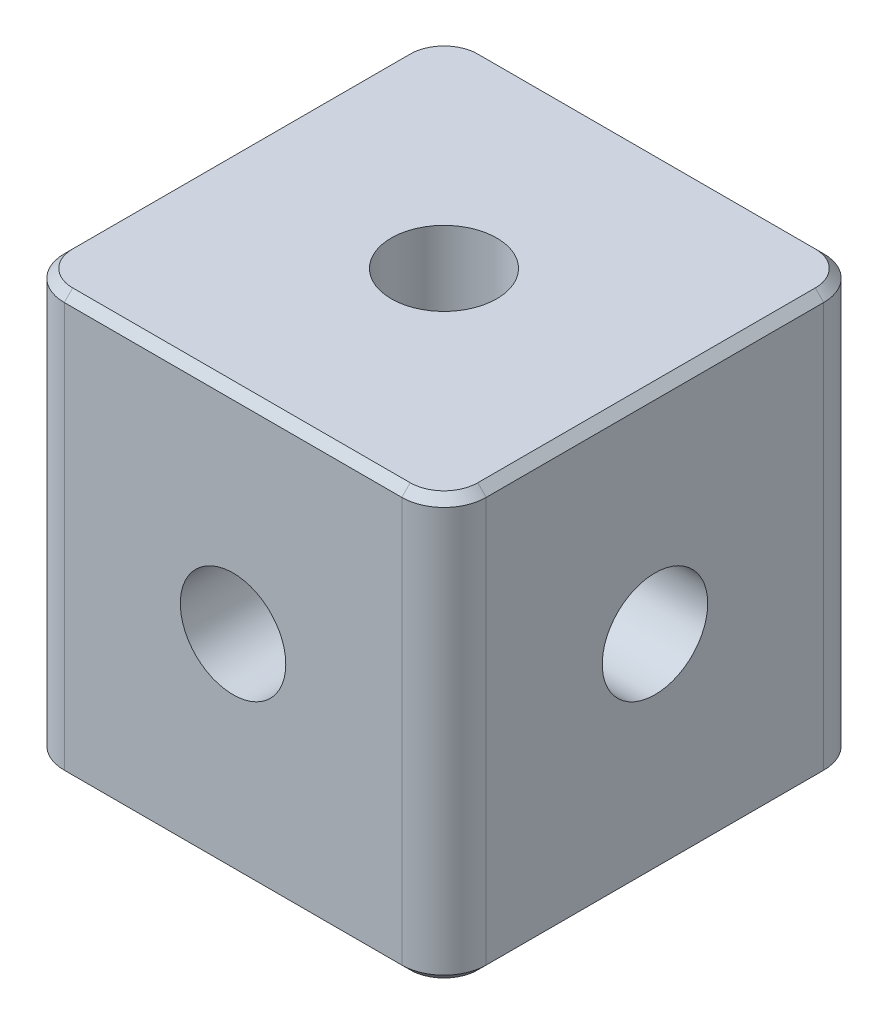
ISO-10303-21;
HEADER;
FILE_DESCRIPTION(('STEP AP214'),'2;1');
FILE_NAME('part.step','',(''),(''),'','','');
FILE_SCHEMA(('AUTOMOTIVE_DESIGN { 1 0 10303 214 1 1 1 1 }'));
ENDSEC;
DATA;
#1=APPLICATION_CONTEXT('core data for automotive mechanical design processes');
#2=APPLICATION_PROTOCOL_DEFINITION('international standard','automotive_design',2000,#1);
#3=PRODUCT_CONTEXT('',#1,'mechanical');
#4=PRODUCT('Part','Part','',(#3));
#5=PRODUCT_RELATED_PRODUCT_CATEGORY('part','',(#4));
#6=PRODUCT_DEFINITION_FORMATION('','',#4);
#7=PRODUCT_DEFINITION_CONTEXT('part definition',#1,'design');
#8=PRODUCT_DEFINITION('design','',#6,#7);
#9=PRODUCT_DEFINITION_SHAPE('','',#8);
#10=(LENGTH_UNIT() NAMED_UNIT(*) SI_UNIT(.MILLI.,.METRE.));
#11=(NAMED_UNIT(*) PLANE_ANGLE_UNIT() SI_UNIT($,.RADIAN.));
#12=(NAMED_UNIT(*) SI_UNIT($,.STERADIAN.) SOLID_ANGLE_UNIT());
#13=UNCERTAINTY_MEASURE_WITH_UNIT(LENGTH_MEASURE(1.E-05),#10,'distance_accuracy_value','');
#14=(GEOMETRIC_REPRESENTATION_CONTEXT(3) GLOBAL_UNCERTAINTY_ASSIGNED_CONTEXT((#13)) GLOBAL_UNIT_ASSIGNED_CONTEXT((#10,
#11,#12)) REPRESENTATION_CONTEXT('',''));
#15=CARTESIAN_POINT('',(0.,0.,0.));
#16=DIRECTION('',(0.,0.,1.));
#17=DIRECTION('',(1.,0.,0.));
#18=AXIS2_PLACEMENT_3D('',#15,#16,#17);
#19=CARTESIAN_POINT('',(0.,5.,0.));
#20=DIRECTION('',(0.,1.,0.));
#21=DIRECTION('',(0.,0.,1.));
#22=AXIS2_PLACEMENT_3D('',#19,#20,#21);
#23=CYLINDRICAL_SURFACE('',#22,1.25);
#24=CARTESIAN_POINT('',(0.,5.,0.));
#25=DIRECTION('',(0.,1.,0.));
#26=DIRECTION('',(0.,0.,1.));
#27=AXIS2_PLACEMENT_3D('',#24,#25,#26);
#28=CIRCLE('',#27,1.25);
#29=CARTESIAN_POINT('',(0.,5.,1.25));
#30=VERTEX_POINT('',#29);
#31=EDGE_CURVE('E492',#30,#30,#28,.T.);
#32=ORIENTED_EDGE('',*,*,#31,.T.);
#33=EDGE_LOOP('',(#32));
#34=FACE_BOUND('',#33,.T.);
#35=CARTESIAN_POINT('',(0.,0.,0.));
#36=DIRECTION('',(0.,0.707106781186547,-0.707106781186547));
#37=DIRECTION('',(0.,0.707106781186547,0.707106781186547));
#38=AXIS2_PLACEMENT_3D('',#35,#36,#37);
#39=ELLIPSE('',#38,1.76776695296636,1.25);
#40=CARTESIAN_POINT('',(0.883883476483181,0.883883476483181,0.883883476483181));
#41=VERTEX_POINT('',#40);
#42=CARTESIAN_POINT('',(-0.883883476483181,0.883883476483181,0.883883476483181));
#43=VERTEX_POINT('',#42);
#44=EDGE_CURVE('E210',#41,#43,#39,.F.);
#45=ORIENTED_EDGE('',*,*,#44,.T.);
#46=CARTESIAN_POINT('',(0.,0.,0.));
#47=DIRECTION('',(0.707106781186547,0.707106781186547,0.));
#48=DIRECTION('',(-0.707106781186547,0.707106781186547,0.));
#49=AXIS2_PLACEMENT_3D('',#46,#47,#48);
#50=ELLIPSE('',#49,1.76776695296636,1.25);
#51=CARTESIAN_POINT('',(-0.88388347648318,0.88388347648318,-0.88388347648318));
#52=VERTEX_POINT('',#51);
#53=EDGE_CURVE('E193',#43,#52,#50,.F.);
#54=ORIENTED_EDGE('',*,*,#53,.T.);
#55=CARTESIAN_POINT('',(0.,0.,0.));
#56=DIRECTION('',(0.,0.707106781186547,0.707106781186547));
#57=DIRECTION('',(0.,0.707106781186547,-0.707106781186547));
#58=AXIS2_PLACEMENT_3D('',#55,#56,#57);
#59=ELLIPSE('',#58,1.76776695296636,1.25);
#60=CARTESIAN_POINT('',(0.883883476483181,0.883883476483181,-0.883883476483181));
#61=VERTEX_POINT('',#60);
#62=EDGE_CURVE('E203',#52,#61,#59,.F.);
#63=ORIENTED_EDGE('',*,*,#62,.T.);
#64=CARTESIAN_POINT('',(0.,0.,0.));
#65=DIRECTION('',(-0.707106781186547,0.707106781186547,0.));
#66=DIRECTION('',(0.707106781186547,0.707106781186547,0.));
#67=AXIS2_PLACEMENT_3D('',#64,#65,#66);
#68=ELLIPSE('',#67,1.76776695296636,1.25);
#69=EDGE_CURVE('E519',#61,#41,#68,.F.);
#70=ORIENTED_EDGE('',*,*,#69,.T.);
#71=EDGE_LOOP('',(#45,#54,#63,#70));
#72=FACE_BOUND('',#71,.T.);
#73=ADVANCED_FACE('F49',(#34,#72),#23,.F.);
#74=CARTESIAN_POINT('',(5.,5.,5.));
#75=DIRECTION('',(-1.,0.,0.));
#76=DIRECTION('',(0.,0.,1.));
#77=AXIS2_PLACEMENT_3D('',#74,#75,#76);
#78=PLANE('',#77);
#79=CARTESIAN_POINT('',(5.,0.,0.));
#80=DIRECTION('',(1.,0.,0.));
#81=DIRECTION('',(0.,0.,-1.));
#82=AXIS2_PLACEMENT_3D('',#79,#80,#81);
#83=CIRCLE('',#82,1.24999999999999);
#84=CARTESIAN_POINT('',(5.,0.,-1.24999999999999));
#85=VERTEX_POINT('',#84);
#86=EDGE_CURVE('E383',#85,#85,#83,.T.);
#87=ORIENTED_EDGE('',*,*,#86,.F.);
#88=EDGE_LOOP('',(#87));
#89=FACE_BOUND('',#88,.T.);
#90=DIRECTION('',(0.,-1.,0.));
#91=VECTOR('',#90,1.);
#92=CARTESIAN_POINT('',(5.,5.,4.));
#93=LINE('',#92,#91);
#94=CARTESIAN_POINT('',(5.,4.8,4.));
#95=VERTEX_POINT('',#94);
#96=CARTESIAN_POINT('',(5.,-4.8,4.));
#97=VERTEX_POINT('',#96);
#98=EDGE_CURVE('E235',#95,#97,#93,.T.);
#99=ORIENTED_EDGE('',*,*,#98,.T.);
#100=DIRECTION('',(0.,0.,-1.));
#101=VECTOR('',#100,1.);
#102=CARTESIAN_POINT('',(5.,-4.8,-4.));
#103=LINE('',#102,#101);
#104=CARTESIAN_POINT('',(5.,-4.8,-4.));
#105=VERTEX_POINT('',#104);
#106=EDGE_CURVE('E263',#97,#105,#103,.T.);
#107=ORIENTED_EDGE('',*,*,#106,.T.);
#108=DIRECTION('',(0.,-1.,0.));
#109=VECTOR('',#108,1.);
#110=CARTESIAN_POINT('',(5.,5.,-4.));
#111=LINE('',#110,#109);
#112=CARTESIAN_POINT('',(5.,4.8,-4.));
#113=VERTEX_POINT('',#112);
#114=EDGE_CURVE('E239',#105,#113,#111,.F.);
#115=ORIENTED_EDGE('',*,*,#114,.T.);
#116=DIRECTION('',(0.,0.,1.));
#117=VECTOR('',#116,1.);
#118=CARTESIAN_POINT('',(5.,4.8,5.));
#119=LINE('',#118,#117);
#120=EDGE_CURVE('E259',#113,#95,#119,.T.);
#121=ORIENTED_EDGE('',*,*,#120,.T.);
#122=EDGE_LOOP('',(#99,#107,#115,#121));
#123=FACE_BOUND('',#122,.T.);
#124=ADVANCED_FACE('F477',(#89,#123),#78,.F.);
#125=CARTESIAN_POINT('',(-5.,5.,-5.));
#126=DIRECTION('',(0.,0.,1.));
#127=DIRECTION('',(1.,0.,0.));
#128=AXIS2_PLACEMENT_3D('',#125,#126,#127);
#129=PLANE('',#128);
#130=CARTESIAN_POINT('',(0.,0.,-5.));
#131=DIRECTION('',(0.,0.,1.));
#132=DIRECTION('',(1.,0.,0.));
#133=AXIS2_PLACEMENT_3D('',#130,#131,#132);
#134=CIRCLE('',#133,1.25);
#135=CARTESIAN_POINT('',(1.25,0.,-5.));
#136=VERTEX_POINT('',#135);
#137=EDGE_CURVE('E496',#136,#136,#134,.T.);
#138=ORIENTED_EDGE('',*,*,#137,.T.);
#139=EDGE_LOOP('',(#138));
#140=FACE_BOUND('',#139,.T.);
#141=DIRECTION('',(0.,-1.,0.));
#142=VECTOR('',#141,1.);
#143=CARTESIAN_POINT('',(4.,5.,-5.));
#144=LINE('',#143,#142);
#145=CARTESIAN_POINT('',(4.,4.8,-5.));
#146=VERTEX_POINT('',#145);
#147=CARTESIAN_POINT('',(4.,-4.8,-5.));
#148=VERTEX_POINT('',#147);
#149=EDGE_CURVE('E231',#146,#148,#144,.T.);
#150=ORIENTED_EDGE('',*,*,#149,.T.);
#151=DIRECTION('',(-1.,0.,0.));
#152=VECTOR('',#151,1.);
#153=CARTESIAN_POINT('',(-4.,-4.8,-5.));
#154=LINE('',#153,#152);
#155=CARTESIAN_POINT('',(-4.,-4.8,-5.));
#156=VERTEX_POINT('',#155);
#157=EDGE_CURVE('E307',#148,#156,#154,.T.);
#158=ORIENTED_EDGE('',*,*,#157,.T.);
#159=DIRECTION('',(0.,-1.,0.));
#160=VECTOR('',#159,1.);
#161=CARTESIAN_POINT('',(-4.,5.,-5.));
#162=LINE('',#161,#160);
#163=CARTESIAN_POINT('',(-4.,4.8,-5.));
#164=VERTEX_POINT('',#163);
#165=EDGE_CURVE('E227',#156,#164,#162,.F.);
#166=ORIENTED_EDGE('',*,*,#165,.T.);
#167=DIRECTION('',(1.,0.,0.));
#168=VECTOR('',#167,1.);
#169=CARTESIAN_POINT('',(-5.,4.8,-5.));
#170=LINE('',#169,#168);
#171=EDGE_CURVE('E304',#164,#146,#170,.T.);
#172=ORIENTED_EDGE('',*,*,#171,.T.);
#173=EDGE_LOOP('',(#150,#158,#166,#172));
#174=FACE_BOUND('',#173,.T.);
#175=ADVANCED_FACE('F538',(#140,#174),#129,.F.);
#176=CARTESIAN_POINT('',(-5.,5.,5.));
#177=DIRECTION('',(1.,0.,0.));
#178=DIRECTION('',(0.,0.,-1.));
#179=AXIS2_PLACEMENT_3D('',#176,#177,#178);
#180=PLANE('',#179);
#181=CARTESIAN_POINT('',(-5.,0.,0.));
#182=DIRECTION('',(1.,0.,0.));
#183=DIRECTION('',(0.,0.,-1.));
#184=AXIS2_PLACEMENT_3D('',#181,#182,#183);
#185=CIRCLE('',#184,1.25);
#186=CARTESIAN_POINT('',(-5.,0.,-1.25));
#187=VERTEX_POINT('',#186);
#188=EDGE_CURVE('E726',#187,#187,#185,.T.);
#189=ORIENTED_EDGE('',*,*,#188,.T.);
#190=EDGE_LOOP('',(#189));
#191=FACE_BOUND('',#190,.T.);
#192=DIRECTION('',(0.,-1.,0.));
#193=VECTOR('',#192,1.);
#194=CARTESIAN_POINT('',(-5.,5.,-4.));
#195=LINE('',#194,#193);
#196=CARTESIAN_POINT('',(-5.,4.8,-4.));
#197=VERTEX_POINT('',#196);
#198=CARTESIAN_POINT('',(-5.,-4.8,-4.));
#199=VERTEX_POINT('',#198);
#200=EDGE_CURVE('E251',#197,#199,#195,.T.);
#201=ORIENTED_EDGE('',*,*,#200,.T.);
#202=DIRECTION('',(0.,0.,1.));
#203=VECTOR('',#202,1.);
#204=CARTESIAN_POINT('',(-5.,-4.8,4.));
#205=LINE('',#204,#203);
#206=CARTESIAN_POINT('',(-5.,-4.8,4.));
#207=VERTEX_POINT('',#206);
#208=EDGE_CURVE('E331',#199,#207,#205,.T.);
#209=ORIENTED_EDGE('',*,*,#208,.T.);
#210=DIRECTION('',(0.,-1.,0.));
#211=VECTOR('',#210,1.);
#212=CARTESIAN_POINT('',(-5.,5.,4.));
#213=LINE('',#212,#211);
#214=CARTESIAN_POINT('',(-5.,4.8,4.));
#215=VERTEX_POINT('',#214);
#216=EDGE_CURVE('E255',#207,#215,#213,.F.);
#217=ORIENTED_EDGE('',*,*,#216,.T.);
#218=DIRECTION('',(0.,0.,-1.));
#219=VECTOR('',#218,1.);
#220=CARTESIAN_POINT('',(-5.,4.8,5.));
#221=LINE('',#220,#219);
#222=EDGE_CURVE('E328',#215,#197,#221,.T.);
#223=ORIENTED_EDGE('',*,*,#222,.T.);
#224=EDGE_LOOP('',(#201,#209,#217,#223));
#225=FACE_BOUND('',#224,.T.);
#226=ADVANCED_FACE('F424',(#191,#225),#180,.F.);
#227=CARTESIAN_POINT('',(-5.,5.,5.));
#228=DIRECTION('',(0.,0.,-1.));
#229=DIRECTION('',(-1.,0.,0.));
#230=AXIS2_PLACEMENT_3D('',#227,#228,#229);
#231=PLANE('',#230);
#232=CARTESIAN_POINT('',(0.,0.,5.));
#233=DIRECTION('',(0.,0.,1.));
#234=DIRECTION('',(1.,0.,0.));
#235=AXIS2_PLACEMENT_3D('',#232,#233,#234);
#236=CIRCLE('',#235,1.24999999999999);
#237=CARTESIAN_POINT('',(1.24999999999999,0.,5.));
#238=VERTEX_POINT('',#237);
#239=EDGE_CURVE('E503',#238,#238,#236,.T.);
#240=ORIENTED_EDGE('',*,*,#239,.F.);
#241=EDGE_LOOP('',(#240));
#242=FACE_BOUND('',#241,.T.);
#243=DIRECTION('',(0.,-1.,0.));
#244=VECTOR('',#243,1.);
#245=CARTESIAN_POINT('',(-4.,5.,5.));
#246=LINE('',#245,#244);
#247=CARTESIAN_POINT('',(-4.,4.8,5.));
#248=VERTEX_POINT('',#247);
#249=CARTESIAN_POINT('',(-4.,-4.8,5.));
#250=VERTEX_POINT('',#249);
#251=EDGE_CURVE('E243',#248,#250,#246,.T.);
#252=ORIENTED_EDGE('',*,*,#251,.T.);
#253=DIRECTION('',(1.,0.,0.));
#254=VECTOR('',#253,1.);
#255=CARTESIAN_POINT('',(4.,-4.8,5.));
#256=LINE('',#255,#254);
#257=CARTESIAN_POINT('',(4.,-4.8,5.));
#258=VERTEX_POINT('',#257);
#259=EDGE_CURVE('E313',#250,#258,#256,.T.);
#260=ORIENTED_EDGE('',*,*,#259,.T.);
#261=DIRECTION('',(0.,-1.,0.));
#262=VECTOR('',#261,1.);
#263=CARTESIAN_POINT('',(4.,5.,5.));
#264=LINE('',#263,#262);
#265=CARTESIAN_POINT('',(4.,4.8,5.));
#266=VERTEX_POINT('',#265);
#267=EDGE_CURVE('E247',#258,#266,#264,.F.);
#268=ORIENTED_EDGE('',*,*,#267,.T.);
#269=DIRECTION('',(-1.,0.,0.));
#270=VECTOR('',#269,1.);
#271=CARTESIAN_POINT('',(-5.,4.8,5.));
#272=LINE('',#271,#270);
#273=EDGE_CURVE('E310',#266,#248,#272,.T.);
#274=ORIENTED_EDGE('',*,*,#273,.T.);
#275=EDGE_LOOP('',(#252,#260,#268,#274));
#276=FACE_BOUND('',#275,.T.);
#277=ADVANCED_FACE('F457',(#242,#276),#231,.F.);
#278=CARTESIAN_POINT('',(0.,5.,0.));
#279=DIRECTION('',(0.,-1.,0.));
#280=DIRECTION('',(0.,0.,-1.));
#281=AXIS2_PLACEMENT_3D('',#278,#279,#280);
#282=PLANE('',#281);
#283=CARTESIAN_POINT('',(4.,5.,4.));
#284=DIRECTION('',(0.,-1.,0.));
#285=DIRECTION('',(0.,0.,-1.));
#286=AXIS2_PLACEMENT_3D('',#283,#284,#285);
#287=CIRCLE('',#286,0.800000000000001);
#288=CARTESIAN_POINT('',(4.,5.,4.8));
#289=VERTEX_POINT('',#288);
#290=CARTESIAN_POINT('',(4.8,5.,4.));
#291=VERTEX_POINT('',#290);
#292=EDGE_CURVE('E74',#289,#291,#287,.F.);
#293=ORIENTED_EDGE('',*,*,#292,.T.);
#294=DIRECTION('',(0.,0.,-1.));
#295=VECTOR('',#294,1.);
#296=CARTESIAN_POINT('',(4.8,5.,0.));
#297=LINE('',#296,#295);
#298=CARTESIAN_POINT('',(4.8,5.,-4.));
#299=VERTEX_POINT('',#298);
#300=EDGE_CURVE('E11',#291,#299,#297,.T.);
#301=ORIENTED_EDGE('',*,*,#300,.T.);
#302=CARTESIAN_POINT('',(4.,5.,-4.));
#303=DIRECTION('',(0.,-1.,0.));
#304=DIRECTION('',(0.,0.,-1.));
#305=AXIS2_PLACEMENT_3D('',#302,#303,#304);
#306=CIRCLE('',#305,0.800000000000001);
#307=CARTESIAN_POINT('',(4.,5.,-4.8));
#308=VERTEX_POINT('',#307);
#309=EDGE_CURVE('E59',#299,#308,#306,.F.);
#310=ORIENTED_EDGE('',*,*,#309,.T.);
#311=DIRECTION('',(-1.,0.,0.));
#312=VECTOR('',#311,1.);
#313=CARTESIAN_POINT('',(0.,5.,-4.8));
#314=LINE('',#313,#312);
#315=CARTESIAN_POINT('',(-4.,5.,-4.8));
#316=VERTEX_POINT('',#315);
#317=EDGE_CURVE('E346',#308,#316,#314,.T.);
#318=ORIENTED_EDGE('',*,*,#317,.T.);
#319=CARTESIAN_POINT('',(-4.,5.,-4.));
#320=DIRECTION('',(0.,-1.,0.));
#321=DIRECTION('',(0.,0.,-1.));
#322=AXIS2_PLACEMENT_3D('',#319,#320,#321);
#323=CIRCLE('',#322,0.800000000000001);
#324=CARTESIAN_POINT('',(-4.8,5.,-4.));
#325=VERTEX_POINT('',#324);
#326=EDGE_CURVE('E340',#316,#325,#323,.F.);
#327=ORIENTED_EDGE('',*,*,#326,.T.);
#328=DIRECTION('',(0.,0.,1.));
#329=VECTOR('',#328,1.);
#330=CARTESIAN_POINT('',(-4.8,5.,0.));
#331=LINE('',#330,#329);
#332=CARTESIAN_POINT('',(-4.8,5.,4.));
#333=VERTEX_POINT('',#332);
#334=EDGE_CURVE('E334',#325,#333,#331,.T.);
#335=ORIENTED_EDGE('',*,*,#334,.T.);
#336=CARTESIAN_POINT('',(-4.,5.,4.));
#337=DIRECTION('',(0.,-1.,0.));
#338=DIRECTION('',(0.,0.,-1.));
#339=AXIS2_PLACEMENT_3D('',#336,#337,#338);
#340=CIRCLE('',#339,0.800000000000001);
#341=CARTESIAN_POINT('',(-4.,5.,4.8));
#342=VERTEX_POINT('',#341);
#343=EDGE_CURVE('E337',#333,#342,#340,.F.);
#344=ORIENTED_EDGE('',*,*,#343,.T.);
#345=DIRECTION('',(1.,0.,0.));
#346=VECTOR('',#345,1.);
#347=CARTESIAN_POINT('',(0.,5.,4.8));
#348=LINE('',#347,#346);
#349=EDGE_CURVE('E343',#342,#289,#348,.T.);
#350=ORIENTED_EDGE('',*,*,#349,.T.);
#351=EDGE_LOOP('',(#293,#301,#310,#318,#327,#335,#344,#350));
#352=FACE_BOUND('',#351,.T.);
#353=ORIENTED_EDGE('',*,*,#31,.F.);
#354=EDGE_LOOP('',(#353));
#355=FACE_BOUND('',#354,.T.);
#356=ADVANCED_FACE('F486',(#352,#355),#282,.F.);
#357=CARTESIAN_POINT('',(0.,-5.,0.));
#358=DIRECTION('',(0.,-1.,0.));
#359=DIRECTION('',(0.,0.,-1.));
#360=AXIS2_PLACEMENT_3D('',#357,#358,#359);
#361=PLANE('',#360);
#362=CARTESIAN_POINT('',(4.,-5.,-4.));
#363=DIRECTION('',(0.,-1.,0.));
#364=DIRECTION('',(0.,0.,-1.));
#365=AXIS2_PLACEMENT_3D('',#362,#363,#364);
#366=CIRCLE('',#365,0.800000000000001);
#367=CARTESIAN_POINT('',(4.,-5.,-4.8));
#368=VERTEX_POINT('',#367);
#369=CARTESIAN_POINT('',(4.8,-5.,-4.));
#370=VERTEX_POINT('',#369);
#371=EDGE_CURVE('E285',#368,#370,#366,.T.);
#372=ORIENTED_EDGE('',*,*,#371,.T.);
#373=DIRECTION('',(0.,0.,1.));
#374=VECTOR('',#373,1.);
#375=CARTESIAN_POINT('',(4.8,-5.,4.));
#376=LINE('',#375,#374);
#377=CARTESIAN_POINT('',(4.8,-5.,4.));
#378=VERTEX_POINT('',#377);
#379=EDGE_CURVE('E288',#370,#378,#376,.T.);
#380=ORIENTED_EDGE('',*,*,#379,.T.);
#381=CARTESIAN_POINT('',(4.,-5.,4.));
#382=DIRECTION('',(0.,-1.,0.));
#383=DIRECTION('',(0.,0.,-1.));
#384=AXIS2_PLACEMENT_3D('',#381,#382,#383);
#385=CIRCLE('',#384,0.800000000000001);
#386=CARTESIAN_POINT('',(4.,-5.,4.8));
#387=VERTEX_POINT('',#386);
#388=EDGE_CURVE('E282',#378,#387,#385,.T.);
#389=ORIENTED_EDGE('',*,*,#388,.T.);
#390=DIRECTION('',(-1.,0.,0.));
#391=VECTOR('',#390,1.);
#392=CARTESIAN_POINT('',(-4.,-5.,4.8));
#393=LINE('',#392,#391);
#394=CARTESIAN_POINT('',(-4.,-5.,4.8));
#395=VERTEX_POINT('',#394);
#396=EDGE_CURVE('E276',#387,#395,#393,.T.);
#397=ORIENTED_EDGE('',*,*,#396,.T.);
#398=CARTESIAN_POINT('',(-4.,-5.,4.));
#399=DIRECTION('',(0.,-1.,0.));
#400=DIRECTION('',(0.,0.,-1.));
#401=AXIS2_PLACEMENT_3D('',#398,#399,#400);
#402=CIRCLE('',#401,0.800000000000001);
#403=CARTESIAN_POINT('',(-4.8,-5.,4.));
#404=VERTEX_POINT('',#403);
#405=EDGE_CURVE('E270',#395,#404,#402,.T.);
#406=ORIENTED_EDGE('',*,*,#405,.T.);
#407=DIRECTION('',(0.,0.,-1.));
#408=VECTOR('',#407,1.);
#409=CARTESIAN_POINT('',(-4.8,-5.,-4.));
#410=LINE('',#409,#408);
#411=CARTESIAN_POINT('',(-4.8,-5.,-4.));
#412=VERTEX_POINT('',#411);
#413=EDGE_CURVE('E267',#404,#412,#410,.T.);
#414=ORIENTED_EDGE('',*,*,#413,.T.);
#415=CARTESIAN_POINT('',(-4.,-5.,-4.));
#416=DIRECTION('',(0.,-1.,0.));
#417=DIRECTION('',(0.,0.,-1.));
#418=AXIS2_PLACEMENT_3D('',#415,#416,#417);
#419=CIRCLE('',#418,0.800000000000001);
#420=CARTESIAN_POINT('',(-4.,-5.,-4.8));
#421=VERTEX_POINT('',#420);
#422=EDGE_CURVE('E273',#412,#421,#419,.T.);
#423=ORIENTED_EDGE('',*,*,#422,.T.);
#424=DIRECTION('',(1.,0.,0.));
#425=VECTOR('',#424,1.);
#426=CARTESIAN_POINT('',(4.,-5.,-4.8));
#427=LINE('',#426,#425);
#428=EDGE_CURVE('E279',#421,#368,#427,.T.);
#429=ORIENTED_EDGE('',*,*,#428,.T.);
#430=EDGE_LOOP('',(#372,#380,#389,#397,#406,#414,#423,#429));
#431=FACE_BOUND('',#430,.T.);
#432=CARTESIAN_POINT('',(0.,-5.,0.));
#433=DIRECTION('',(0.,1.,0.));
#434=DIRECTION('',(0.,0.,1.));
#435=AXIS2_PLACEMENT_3D('',#432,#433,#434);
#436=CIRCLE('',#435,1.25);
#437=CARTESIAN_POINT('',(0.,-5.,1.25));
#438=VERTEX_POINT('',#437);
#439=EDGE_CURVE('E495',#438,#438,#436,.T.);
#440=ORIENTED_EDGE('',*,*,#439,.T.);
#441=EDGE_LOOP('',(#440));
#442=FACE_BOUND('',#441,.T.);
#443=ADVANCED_FACE('F443',(#431,#442),#361,.T.);
#444=CARTESIAN_POINT('',(0.,0.,0.));
#445=DIRECTION('',(0.,0.707106781186547,0.707106781186547));
#446=DIRECTION('',(0.,0.707106781186547,-0.707106781186547));
#447=AXIS2_PLACEMENT_3D('',#444,#445,#446);
#448=ELLIPSE('',#447,1.76776695296636,1.25);
#449=CARTESIAN_POINT('',(-0.883883476483181,-0.883883476483181,0.883883476483181));
#450=VERTEX_POINT('',#449);
#451=CARTESIAN_POINT('',(0.883883476483181,-0.883883476483181,0.883883476483181));
#452=VERTEX_POINT('',#451);
#453=EDGE_CURVE('E217',#450,#452,#448,.T.);
#454=ORIENTED_EDGE('',*,*,#453,.T.);
#455=CARTESIAN_POINT('',(0.,0.,0.));
#456=DIRECTION('',(0.707106781186547,0.707106781186547,0.));
#457=DIRECTION('',(-0.707106781186547,0.707106781186547,0.));
#458=AXIS2_PLACEMENT_3D('',#455,#456,#457);
#459=ELLIPSE('',#458,1.76776695296636,1.25);
#460=CARTESIAN_POINT('',(0.88388347648318,-0.88388347648318,-0.88388347648318));
#461=VERTEX_POINT('',#460);
#462=EDGE_CURVE('E514',#452,#461,#459,.T.);
#463=ORIENTED_EDGE('',*,*,#462,.T.);
#464=CARTESIAN_POINT('',(0.,0.,0.));
#465=DIRECTION('',(0.,0.707106781186547,-0.707106781186547));
#466=DIRECTION('',(0.,0.707106781186547,0.707106781186547));
#467=AXIS2_PLACEMENT_3D('',#464,#465,#466);
#468=ELLIPSE('',#467,1.76776695296636,1.25);
#469=CARTESIAN_POINT('',(-0.88388347648318,-0.88388347648318,-0.88388347648318));
#470=VERTEX_POINT('',#469);
#471=EDGE_CURVE('E221',#461,#470,#468,.T.);
#472=ORIENTED_EDGE('',*,*,#471,.T.);
#473=CARTESIAN_POINT('',(0.,0.,0.));
#474=DIRECTION('',(-0.707106781186547,0.707106781186547,0.));
#475=DIRECTION('',(0.707106781186547,0.707106781186547,0.));
#476=AXIS2_PLACEMENT_3D('',#473,#474,#475);
#477=ELLIPSE('',#476,1.76776695296636,1.25);
#478=EDGE_CURVE('E196',#470,#450,#477,.T.);
#479=ORIENTED_EDGE('',*,*,#478,.T.);
#480=EDGE_LOOP('',(#454,#463,#472,#479));
#481=FACE_BOUND('',#480,.T.);
#482=ORIENTED_EDGE('',*,*,#439,.F.);
#483=EDGE_LOOP('',(#482));
#484=FACE_BOUND('',#483,.T.);
#485=ADVANCED_FACE('F511',(#481,#484),#23,.F.);
#486=CARTESIAN_POINT('',(0.,0.,5.));
#487=DIRECTION('',(0.,0.,1.));
#488=DIRECTION('',(1.,0.,0.));
#489=AXIS2_PLACEMENT_3D('',#486,#487,#488);
#490=CYLINDRICAL_SURFACE('',#489,1.24999999999999);
#491=ORIENTED_EDGE('',*,*,#239,.T.);
#492=EDGE_LOOP('',(#491));
#493=FACE_BOUND('',#492,.T.);
#494=ORIENTED_EDGE('',*,*,#453,.F.);
#495=CARTESIAN_POINT('',(0.,0.,0.));
#496=DIRECTION('',(0.707106781186547,0.,0.707106781186547));
#497=DIRECTION('',(-0.707106781186547,0.,0.707106781186547));
#498=AXIS2_PLACEMENT_3D('',#495,#496,#497);
#499=ELLIPSE('',#498,1.76776695296636,1.24999999999999);
#500=EDGE_CURVE('E212',#450,#43,#499,.F.);
#501=ORIENTED_EDGE('',*,*,#500,.T.);
#502=ORIENTED_EDGE('',*,*,#44,.F.);
#503=CARTESIAN_POINT('',(0.,0.,0.));
#504=DIRECTION('',(-0.707106781186547,0.,0.707106781186547));
#505=DIRECTION('',(0.707106781186547,0.,0.707106781186547));
#506=AXIS2_PLACEMENT_3D('',#503,#504,#505);
#507=ELLIPSE('',#506,1.76776695296636,1.24999999999999);
#508=EDGE_CURVE('E518',#41,#452,#507,.F.);
#509=ORIENTED_EDGE('',*,*,#508,.T.);
#510=EDGE_LOOP('',(#494,#501,#502,#509));
#511=FACE_BOUND('',#510,.T.);
#512=ADVANCED_FACE('F530',(#493,#511),#490,.F.);
#513=ORIENTED_EDGE('',*,*,#137,.F.);
#514=EDGE_LOOP('',(#513));
#515=FACE_BOUND('',#514,.T.);
#516=ORIENTED_EDGE('',*,*,#471,.F.);
#517=CARTESIAN_POINT('',(0.,0.,0.));
#518=DIRECTION('',(0.707106781186547,0.,0.707106781186547));
#519=DIRECTION('',(-0.707106781186547,0.,0.707106781186547));
#520=AXIS2_PLACEMENT_3D('',#517,#518,#519);
#521=ELLIPSE('',#520,1.76776695296636,1.24999999999999);
#522=EDGE_CURVE('E202',#461,#61,#521,.T.);
#523=ORIENTED_EDGE('',*,*,#522,.T.);
#524=ORIENTED_EDGE('',*,*,#62,.F.);
#525=CARTESIAN_POINT('',(0.,0.,0.));
#526=DIRECTION('',(-0.707106781186547,0.,0.707106781186547));
#527=DIRECTION('',(0.707106781186547,0.,0.707106781186547));
#528=AXIS2_PLACEMENT_3D('',#525,#526,#527);
#529=ELLIPSE('',#528,1.76776695296636,1.24999999999999);
#530=EDGE_CURVE('E190',#52,#470,#529,.T.);
#531=ORIENTED_EDGE('',*,*,#530,.T.);
#532=EDGE_LOOP('',(#516,#523,#524,#531));
#533=FACE_BOUND('',#532,.T.);
#534=ADVANCED_FACE('F215',(#515,#533),#490,.F.);
#535=CARTESIAN_POINT('',(5.,0.,0.));
#536=DIRECTION('',(1.,0.,0.));
#537=DIRECTION('',(0.,0.,-1.));
#538=AXIS2_PLACEMENT_3D('',#535,#536,#537);
#539=CYLINDRICAL_SURFACE('',#538,1.24999999999999);
#540=ORIENTED_EDGE('',*,*,#188,.F.);
#541=EDGE_LOOP('',(#540));
#542=FACE_BOUND('',#541,.T.);
#543=ORIENTED_EDGE('',*,*,#478,.F.);
#544=ORIENTED_EDGE('',*,*,#530,.F.);
#545=ORIENTED_EDGE('',*,*,#53,.F.);
#546=ORIENTED_EDGE('',*,*,#500,.F.);
#547=EDGE_LOOP('',(#543,#544,#545,#546));
#548=FACE_BOUND('',#547,.T.);
#549=ADVANCED_FACE('F192',(#542,#548),#539,.F.);
#550=ORIENTED_EDGE('',*,*,#86,.T.);
#551=EDGE_LOOP('',(#550));
#552=FACE_BOUND('',#551,.T.);
#553=ORIENTED_EDGE('',*,*,#69,.F.);
#554=ORIENTED_EDGE('',*,*,#522,.F.);
#555=ORIENTED_EDGE('',*,*,#462,.F.);
#556=ORIENTED_EDGE('',*,*,#508,.F.);
#557=EDGE_LOOP('',(#553,#554,#555,#556));
#558=FACE_BOUND('',#557,.T.);
#559=ADVANCED_FACE('F567',(#552,#558),#539,.F.);
#560=CARTESIAN_POINT('',(4.,5.,-4.));
#561=DIRECTION('',(0.,-1.,0.));
#562=DIRECTION('',(0.,0.,-1.));
#563=AXIS2_PLACEMENT_3D('',#560,#561,#562);
#564=CYLINDRICAL_SURFACE('',#563,1.);
#565=ORIENTED_EDGE('',*,*,#114,.F.);
#566=CARTESIAN_POINT('',(4.,-4.8,-4.));
#567=DIRECTION('',(0.,-1.,0.));
#568=DIRECTION('',(0.,0.,-1.));
#569=AXIS2_PLACEMENT_3D('',#566,#567,#568);
#570=CIRCLE('',#569,1.);
#571=EDGE_CURVE('E295',#105,#148,#570,.F.);
#572=ORIENTED_EDGE('',*,*,#571,.T.);
#573=ORIENTED_EDGE('',*,*,#149,.F.);
#574=CARTESIAN_POINT('',(4.,4.8,-4.));
#575=DIRECTION('',(0.,-1.,0.));
#576=DIRECTION('',(0.,0.,-1.));
#577=AXIS2_PLACEMENT_3D('',#574,#575,#576);
#578=CIRCLE('',#577,1.);
#579=EDGE_CURVE('E292',#146,#113,#578,.T.);
#580=ORIENTED_EDGE('',*,*,#579,.T.);
#581=EDGE_LOOP('',(#565,#572,#573,#580));
#582=FACE_BOUND('',#581,.T.);
#583=ADVANCED_FACE('F563',(#582),#564,.T.);
#584=CARTESIAN_POINT('',(4.,5.,4.));
#585=DIRECTION('',(0.,-1.,0.));
#586=DIRECTION('',(0.,0.,-1.));
#587=AXIS2_PLACEMENT_3D('',#584,#585,#586);
#588=CYLINDRICAL_SURFACE('',#587,1.);
#589=ORIENTED_EDGE('',*,*,#267,.F.);
#590=CARTESIAN_POINT('',(4.,-4.8,4.));
#591=DIRECTION('',(0.,-1.,0.));
#592=DIRECTION('',(0.,0.,-1.));
#593=AXIS2_PLACEMENT_3D('',#590,#591,#592);
#594=CIRCLE('',#593,1.);
#595=EDGE_CURVE('E301',#258,#97,#594,.F.);
#596=ORIENTED_EDGE('',*,*,#595,.T.);
#597=ORIENTED_EDGE('',*,*,#98,.F.);
#598=CARTESIAN_POINT('',(4.,4.8,4.));
#599=DIRECTION('',(0.,-1.,0.));
#600=DIRECTION('',(0.,0.,-1.));
#601=AXIS2_PLACEMENT_3D('',#598,#599,#600);
#602=CIRCLE('',#601,1.);
#603=EDGE_CURVE('E298',#95,#266,#602,.T.);
#604=ORIENTED_EDGE('',*,*,#603,.T.);
#605=EDGE_LOOP('',(#589,#596,#597,#604));
#606=FACE_BOUND('',#605,.T.);
#607=ADVANCED_FACE('F475',(#606),#588,.T.);
#608=CARTESIAN_POINT('',(-4.,5.,4.));
#609=DIRECTION('',(0.,-1.,0.));
#610=DIRECTION('',(0.,0.,-1.));
#611=AXIS2_PLACEMENT_3D('',#608,#609,#610);
#612=CYLINDRICAL_SURFACE('',#611,1.);
#613=ORIENTED_EDGE('',*,*,#216,.F.);
#614=CARTESIAN_POINT('',(-4.,-4.8,4.));
#615=DIRECTION('',(0.,-1.,0.));
#616=DIRECTION('',(0.,0.,-1.));
#617=AXIS2_PLACEMENT_3D('',#614,#615,#616);
#618=CIRCLE('',#617,1.);
#619=EDGE_CURVE('E325',#207,#250,#618,.F.);
#620=ORIENTED_EDGE('',*,*,#619,.T.);
#621=ORIENTED_EDGE('',*,*,#251,.F.);
#622=CARTESIAN_POINT('',(-4.,4.8,4.));
#623=DIRECTION('',(0.,-1.,0.));
#624=DIRECTION('',(0.,0.,-1.));
#625=AXIS2_PLACEMENT_3D('',#622,#623,#624);
#626=CIRCLE('',#625,1.);
#627=EDGE_CURVE('E322',#248,#215,#626,.T.);
#628=ORIENTED_EDGE('',*,*,#627,.T.);
#629=EDGE_LOOP('',(#613,#620,#621,#628));
#630=FACE_BOUND('',#629,.T.);
#631=ADVANCED_FACE('F453',(#630),#612,.T.);
#632=CARTESIAN_POINT('',(-4.,5.,-4.));
#633=DIRECTION('',(0.,-1.,0.));
#634=DIRECTION('',(0.,0.,-1.));
#635=AXIS2_PLACEMENT_3D('',#632,#633,#634);
#636=CYLINDRICAL_SURFACE('',#635,1.);
#637=ORIENTED_EDGE('',*,*,#165,.F.);
#638=CARTESIAN_POINT('',(-4.,-4.8,-4.));
#639=DIRECTION('',(0.,-1.,0.));
#640=DIRECTION('',(0.,0.,-1.));
#641=AXIS2_PLACEMENT_3D('',#638,#639,#640);
#642=CIRCLE('',#641,1.);
#643=EDGE_CURVE('E319',#156,#199,#642,.F.);
#644=ORIENTED_EDGE('',*,*,#643,.T.);
#645=ORIENTED_EDGE('',*,*,#200,.F.);
#646=CARTESIAN_POINT('',(-4.,4.8,-4.));
#647=DIRECTION('',(0.,-1.,0.));
#648=DIRECTION('',(0.,0.,-1.));
#649=AXIS2_PLACEMENT_3D('',#646,#647,#648);
#650=CIRCLE('',#649,1.);
#651=EDGE_CURVE('E316',#197,#164,#650,.T.);
#652=ORIENTED_EDGE('',*,*,#651,.T.);
#653=EDGE_LOOP('',(#637,#644,#645,#652));
#654=FACE_BOUND('',#653,.T.);
#655=ADVANCED_FACE('F429',(#654),#636,.T.);
#656=CARTESIAN_POINT('',(-5.,-4.8,5.));
#657=DIRECTION('',(-0.707106781186545,-0.70710678118655,0.));
#658=DIRECTION('',(0.,0.,-1.));
#659=AXIS2_PLACEMENT_3D('',#656,#657,#658);
#660=PLANE('',#659);
#661=DIRECTION('',(-0.707106781186551,0.707106781186544,0.));
#662=VECTOR('',#661,1.);
#663=CARTESIAN_POINT('',(-4.8,-5.,-4.));
#664=LINE('',#663,#662);
#665=EDGE_CURVE('E375',#412,#199,#664,.T.);
#666=ORIENTED_EDGE('',*,*,#665,.F.);
#667=ORIENTED_EDGE('',*,*,#413,.F.);
#668=DIRECTION('',(0.707106781186551,-0.707106781186544,0.));
#669=VECTOR('',#668,1.);
#670=CARTESIAN_POINT('',(-5.,-4.8,4.));
#671=LINE('',#670,#669);
#672=EDGE_CURVE('E379',#207,#404,#671,.T.);
#673=ORIENTED_EDGE('',*,*,#672,.F.);
#674=ORIENTED_EDGE('',*,*,#208,.F.);
#675=EDGE_LOOP('',(#666,#667,#673,#674));
#676=FACE_BOUND('',#675,.T.);
#677=ADVANCED_FACE('F450',(#676),#660,.T.);
#678=CARTESIAN_POINT('',(-4.,-5.,4.));
#679=DIRECTION('',(0.,1.,0.));
#680=DIRECTION('',(0.,0.,1.));
#681=AXIS2_PLACEMENT_3D('',#678,#679,#680);
#682=CONICAL_SURFACE('',#681,0.800000000000001,0.785398163397453);
#683=ORIENTED_EDGE('',*,*,#672,.T.);
#684=ORIENTED_EDGE('',*,*,#405,.F.);
#685=DIRECTION('',(0.,-0.707106781186544,-0.707106781186551));
#686=VECTOR('',#685,1.);
#687=CARTESIAN_POINT('',(-4.,-4.8,5.));
#688=LINE('',#687,#686);
#689=EDGE_CURVE('E371',#250,#395,#688,.T.);
#690=ORIENTED_EDGE('',*,*,#689,.F.);
#691=ORIENTED_EDGE('',*,*,#619,.F.);
#692=EDGE_LOOP('',(#683,#684,#690,#691));
#693=FACE_BOUND('',#692,.T.);
#694=ADVANCED_FACE('F462',(#693),#682,.T.);
#695=CARTESIAN_POINT('',(-4.,-5.,-4.));
#696=DIRECTION('',(0.,1.,0.));
#697=DIRECTION('',(0.,0.,1.));
#698=AXIS2_PLACEMENT_3D('',#695,#696,#697);
#699=CONICAL_SURFACE('',#698,0.800000000000001,0.785398163397453);
#700=ORIENTED_EDGE('',*,*,#665,.T.);
#701=ORIENTED_EDGE('',*,*,#643,.F.);
#702=DIRECTION('',(0.,0.707106781186544,-0.707106781186551));
#703=VECTOR('',#702,1.);
#704=CARTESIAN_POINT('',(-4.,-5.,-4.8));
#705=LINE('',#704,#703);
#706=EDGE_CURVE('E367',#421,#156,#705,.T.);
#707=ORIENTED_EDGE('',*,*,#706,.F.);
#708=ORIENTED_EDGE('',*,*,#422,.F.);
#709=EDGE_LOOP('',(#700,#701,#707,#708));
#710=FACE_BOUND('',#709,.T.);
#711=ADVANCED_FACE('F433',(#710),#699,.T.);
#712=CARTESIAN_POINT('',(-5.,-4.8,5.));
#713=DIRECTION('',(0.,-0.707106781186551,0.707106781186544));
#714=DIRECTION('',(-1.,0.,0.));
#715=AXIS2_PLACEMENT_3D('',#712,#713,#714);
#716=PLANE('',#715);
#717=ORIENTED_EDGE('',*,*,#689,.T.);
#718=ORIENTED_EDGE('',*,*,#396,.F.);
#719=DIRECTION('',(0.,-0.707106781186544,-0.707106781186551));
#720=VECTOR('',#719,1.);
#721=CARTESIAN_POINT('',(4.,-4.8,5.));
#722=LINE('',#721,#720);
#723=EDGE_CURVE('E363',#258,#387,#722,.T.);
#724=ORIENTED_EDGE('',*,*,#723,.F.);
#725=ORIENTED_EDGE('',*,*,#259,.F.);
#726=EDGE_LOOP('',(#717,#718,#724,#725));
#727=FACE_BOUND('',#726,.T.);
#728=ADVANCED_FACE('F466',(#727),#716,.T.);
#729=CARTESIAN_POINT('',(-5.,-4.8,-5.));
#730=DIRECTION('',(0.,-0.707106781186551,-0.707106781186544));
#731=DIRECTION('',(1.,0.,0.));
#732=AXIS2_PLACEMENT_3D('',#729,#730,#731);
#733=PLANE('',#732);
#734=ORIENTED_EDGE('',*,*,#706,.T.);
#735=ORIENTED_EDGE('',*,*,#157,.F.);
#736=DIRECTION('',(0.,0.707106781186544,-0.707106781186551));
#737=VECTOR('',#736,1.);
#738=CARTESIAN_POINT('',(4.,-5.,-4.8));
#739=LINE('',#738,#737);
#740=EDGE_CURVE('E359',#368,#148,#739,.T.);
#741=ORIENTED_EDGE('',*,*,#740,.F.);
#742=ORIENTED_EDGE('',*,*,#428,.F.);
#743=EDGE_LOOP('',(#734,#735,#741,#742));
#744=FACE_BOUND('',#743,.T.);
#745=ADVANCED_FACE('F439',(#744),#733,.T.);
#746=CARTESIAN_POINT('',(4.,-5.,4.));
#747=DIRECTION('',(0.,1.,0.));
#748=DIRECTION('',(0.,0.,1.));
#749=AXIS2_PLACEMENT_3D('',#746,#747,#748);
#750=CONICAL_SURFACE('',#749,0.800000000000001,0.785398163397453);
#751=ORIENTED_EDGE('',*,*,#723,.T.);
#752=ORIENTED_EDGE('',*,*,#388,.F.);
#753=DIRECTION('',(-0.707106781186551,-0.707106781186544,0.));
#754=VECTOR('',#753,1.);
#755=CARTESIAN_POINT('',(5.,-4.8,4.));
#756=LINE('',#755,#754);
#757=EDGE_CURVE('E356',#97,#378,#756,.T.);
#758=ORIENTED_EDGE('',*,*,#757,.F.);
#759=ORIENTED_EDGE('',*,*,#595,.F.);
#760=EDGE_LOOP('',(#751,#752,#758,#759));
#761=FACE_BOUND('',#760,.T.);
#762=ADVANCED_FACE('F471',(#761),#750,.T.);
#763=CARTESIAN_POINT('',(4.,-5.,-4.));
#764=DIRECTION('',(0.,1.,0.));
#765=DIRECTION('',(0.,0.,1.));
#766=AXIS2_PLACEMENT_3D('',#763,#764,#765);
#767=CONICAL_SURFACE('',#766,0.800000000000001,0.785398163397453);
#768=ORIENTED_EDGE('',*,*,#740,.T.);
#769=ORIENTED_EDGE('',*,*,#571,.F.);
#770=DIRECTION('',(0.707106781186551,0.707106781186544,0.));
#771=VECTOR('',#770,1.);
#772=CARTESIAN_POINT('',(4.8,-5.,-4.));
#773=LINE('',#772,#771);
#774=EDGE_CURVE('E353',#370,#105,#773,.T.);
#775=ORIENTED_EDGE('',*,*,#774,.F.);
#776=ORIENTED_EDGE('',*,*,#371,.F.);
#777=EDGE_LOOP('',(#768,#769,#775,#776));
#778=FACE_BOUND('',#777,.T.);
#779=ADVANCED_FACE('F624',(#778),#767,.T.);
#780=CARTESIAN_POINT('',(5.,-4.8,5.));
#781=DIRECTION('',(0.707106781186544,-0.707106781186551,0.));
#782=DIRECTION('',(0.,0.,1.));
#783=AXIS2_PLACEMENT_3D('',#780,#781,#782);
#784=PLANE('',#783);
#785=ORIENTED_EDGE('',*,*,#757,.T.);
#786=ORIENTED_EDGE('',*,*,#379,.F.);
#787=ORIENTED_EDGE('',*,*,#774,.T.);
#788=ORIENTED_EDGE('',*,*,#106,.F.);
#789=EDGE_LOOP('',(#785,#786,#787,#788));
#790=FACE_BOUND('',#789,.T.);
#791=ADVANCED_FACE('F631',(#790),#784,.T.);
#792=CARTESIAN_POINT('',(-4.8,5.,0.));
#793=DIRECTION('',(0.707106781186554,-0.707106781186541,0.));
#794=DIRECTION('',(0.,0.,1.));
#795=AXIS2_PLACEMENT_3D('',#792,#793,#794);
#796=PLANE('',#795);
#797=DIRECTION('',(0.70710678118654,0.707106781186555,0.));
#798=VECTOR('',#797,1.);
#799=CARTESIAN_POINT('',(-5.,4.8,-4.));
#800=LINE('',#799,#798);
#801=EDGE_CURVE('E404',#197,#325,#800,.T.);
#802=ORIENTED_EDGE('',*,*,#801,.F.);
#803=ORIENTED_EDGE('',*,*,#222,.F.);
#804=DIRECTION('',(-0.70710678118654,-0.707106781186555,0.));
#805=VECTOR('',#804,1.);
#806=CARTESIAN_POINT('',(-4.8,5.,4.));
#807=LINE('',#806,#805);
#808=EDGE_CURVE('E53',#333,#215,#807,.T.);
#809=ORIENTED_EDGE('',*,*,#808,.F.);
#810=ORIENTED_EDGE('',*,*,#334,.F.);
#811=EDGE_LOOP('',(#802,#803,#809,#810));
#812=FACE_BOUND('',#811,.T.);
#813=ADVANCED_FACE('F51',(#812),#796,.F.);
#814=CARTESIAN_POINT('',(-4.,5.,4.));
#815=DIRECTION('',(0.,-1.,0.));
#816=DIRECTION('',(0.,0.,-1.));
#817=AXIS2_PLACEMENT_3D('',#814,#815,#816);
#818=CONICAL_SURFACE('',#817,0.800000000000001,0.78539816339744);
#819=ORIENTED_EDGE('',*,*,#808,.T.);
#820=ORIENTED_EDGE('',*,*,#627,.F.);
#821=DIRECTION('',(0.,-0.707106781186554,0.707106781186541));
#822=VECTOR('',#821,1.);
#823=CARTESIAN_POINT('',(-4.,5.,4.8));
#824=LINE('',#823,#822);
#825=EDGE_CURVE('E401',#342,#248,#824,.T.);
#826=ORIENTED_EDGE('',*,*,#825,.F.);
#827=ORIENTED_EDGE('',*,*,#343,.F.);
#828=EDGE_LOOP('',(#819,#820,#826,#827));
#829=FACE_BOUND('',#828,.T.);
#830=ADVANCED_FACE('F417',(#829),#818,.T.);
#831=CARTESIAN_POINT('',(-4.,5.,-4.));
#832=DIRECTION('',(0.,-1.,0.));
#833=DIRECTION('',(0.,0.,-1.));
#834=AXIS2_PLACEMENT_3D('',#831,#832,#833);
#835=CONICAL_SURFACE('',#834,0.800000000000001,0.78539816339744);
#836=ORIENTED_EDGE('',*,*,#801,.T.);
#837=ORIENTED_EDGE('',*,*,#326,.F.);
#838=DIRECTION('',(0.,0.707106781186554,0.707106781186541));
#839=VECTOR('',#838,1.);
#840=CARTESIAN_POINT('',(-4.,4.8,-5.));
#841=LINE('',#840,#839);
#842=EDGE_CURVE('E397',#164,#316,#841,.T.);
#843=ORIENTED_EDGE('',*,*,#842,.F.);
#844=ORIENTED_EDGE('',*,*,#651,.F.);
#845=EDGE_LOOP('',(#836,#837,#843,#844));
#846=FACE_BOUND('',#845,.T.);
#847=ADVANCED_FACE('F651',(#846),#835,.T.);
#848=CARTESIAN_POINT('',(0.,5.,4.8));
#849=DIRECTION('',(0.,-0.707106781186541,-0.707106781186554));
#850=DIRECTION('',(1.,0.,0.));
#851=AXIS2_PLACEMENT_3D('',#848,#849,#850);
#852=PLANE('',#851);
#853=ORIENTED_EDGE('',*,*,#825,.T.);
#854=ORIENTED_EDGE('',*,*,#273,.F.);
#855=DIRECTION('',(0.,-0.707106781186554,0.707106781186541));
#856=VECTOR('',#855,1.);
#857=CARTESIAN_POINT('',(4.,5.,4.8));
#858=LINE('',#857,#856);
#859=EDGE_CURVE('E393',#289,#266,#858,.T.);
#860=ORIENTED_EDGE('',*,*,#859,.F.);
#861=ORIENTED_EDGE('',*,*,#349,.F.);
#862=EDGE_LOOP('',(#853,#854,#860,#861));
#863=FACE_BOUND('',#862,.T.);
#864=ADVANCED_FACE('F657',(#863),#852,.F.);
#865=CARTESIAN_POINT('',(0.,5.,-4.8));
#866=DIRECTION('',(0.,-0.707106781186541,0.707106781186554));
#867=DIRECTION('',(-1.,0.,0.));
#868=AXIS2_PLACEMENT_3D('',#865,#866,#867);
#869=PLANE('',#868);
#870=ORIENTED_EDGE('',*,*,#842,.T.);
#871=ORIENTED_EDGE('',*,*,#317,.F.);
#872=DIRECTION('',(0.,0.707106781186554,0.707106781186541));
#873=VECTOR('',#872,1.);
#874=CARTESIAN_POINT('',(4.,4.8,-5.));
#875=LINE('',#874,#873);
#876=EDGE_CURVE('E389',#146,#308,#875,.T.);
#877=ORIENTED_EDGE('',*,*,#876,.F.);
#878=ORIENTED_EDGE('',*,*,#171,.F.);
#879=EDGE_LOOP('',(#870,#871,#877,#878));
#880=FACE_BOUND('',#879,.T.);
#881=ADVANCED_FACE('F664',(#880),#869,.F.);
#882=CARTESIAN_POINT('',(4.,5.,4.));
#883=DIRECTION('',(0.,-1.,0.));
#884=DIRECTION('',(0.,0.,-1.));
#885=AXIS2_PLACEMENT_3D('',#882,#883,#884);
#886=CONICAL_SURFACE('',#885,0.800000000000001,0.78539816339744);
#887=ORIENTED_EDGE('',*,*,#859,.T.);
#888=ORIENTED_EDGE('',*,*,#603,.F.);
#889=DIRECTION('',(0.707106781186541,-0.707106781186554,0.));
#890=VECTOR('',#889,1.);
#891=CARTESIAN_POINT('',(4.8,5.,4.));
#892=LINE('',#891,#890);
#893=EDGE_CURVE('E386',#291,#95,#892,.T.);
#894=ORIENTED_EDGE('',*,*,#893,.F.);
#895=ORIENTED_EDGE('',*,*,#292,.F.);
#896=EDGE_LOOP('',(#887,#888,#894,#895));
#897=FACE_BOUND('',#896,.T.);
#898=ADVANCED_FACE('F672',(#897),#886,.T.);
#899=CARTESIAN_POINT('',(4.,5.,-4.));
#900=DIRECTION('',(0.,-1.,0.));
#901=DIRECTION('',(0.,0.,-1.));
#902=AXIS2_PLACEMENT_3D('',#899,#900,#901);
#903=CONICAL_SURFACE('',#902,0.800000000000001,0.78539816339744);
#904=ORIENTED_EDGE('',*,*,#876,.T.);
#905=ORIENTED_EDGE('',*,*,#309,.F.);
#906=DIRECTION('',(-0.707106781186541,0.707106781186554,0.));
#907=VECTOR('',#906,1.);
#908=CARTESIAN_POINT('',(5.,4.8,-4.));
#909=LINE('',#908,#907);
#910=EDGE_CURVE('E67',#113,#299,#909,.T.);
#911=ORIENTED_EDGE('',*,*,#910,.F.);
#912=ORIENTED_EDGE('',*,*,#579,.F.);
#913=EDGE_LOOP('',(#904,#905,#911,#912));
#914=FACE_BOUND('',#913,.T.);
#915=ADVANCED_FACE('F483',(#914),#903,.T.);
#916=CARTESIAN_POINT('',(4.8,5.,0.));
#917=DIRECTION('',(-0.707106781186554,-0.707106781186541,0.));
#918=DIRECTION('',(0.,0.,-1.));
#919=AXIS2_PLACEMENT_3D('',#916,#917,#918);
#920=PLANE('',#919);
#921=ORIENTED_EDGE('',*,*,#893,.T.);
#922=ORIENTED_EDGE('',*,*,#120,.F.);
#923=ORIENTED_EDGE('',*,*,#910,.T.);
#924=ORIENTED_EDGE('',*,*,#300,.F.);
#925=EDGE_LOOP('',(#921,#922,#923,#924));
#926=FACE_BOUND('',#925,.T.);
#927=ADVANCED_FACE('F479',(#926),#920,.F.);
#928=CLOSED_SHELL('',(#73,#124,#175,#226,#277,#356,#443,#485,#512,#534,#549,#559,#583,#607,#631,
#655,#677,#694,#711,#728,#745,#762,#779,#791,#813,#830,#847,#864,#881,#898,#915,#927));
#929=MANIFOLD_SOLID_BREP('B2',#928);
#930=ADVANCED_BREP_SHAPE_REPRESENTATION('',(#18,#929),#14);
#931=SHAPE_DEFINITION_REPRESENTATION(#9,#930);
ENDSEC;
END-ISO-10303-21;
